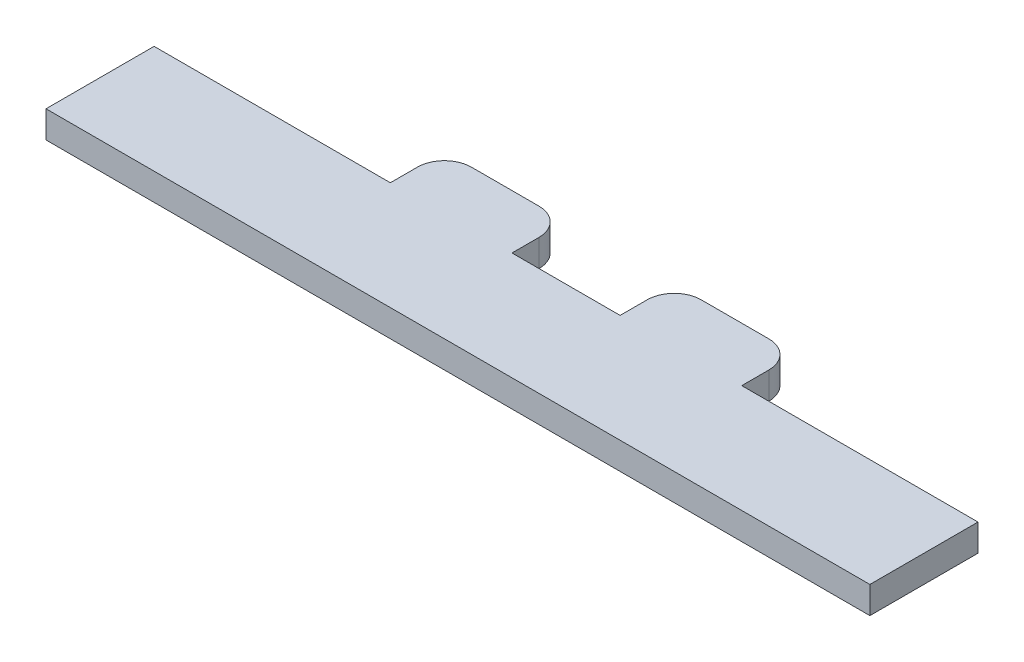
ISO-10303-21;
HEADER;
FILE_DESCRIPTION(('STEP AP214'),'2;1');
FILE_NAME('part.step','',(''),(''),'','','');
FILE_SCHEMA(('AUTOMOTIVE_DESIGN { 1 0 10303 214 1 1 1 1 }'));
ENDSEC;
DATA;
#1=APPLICATION_CONTEXT('core data for automotive mechanical design processes');
#2=APPLICATION_PROTOCOL_DEFINITION('international standard','automotive_design',2000,#1);
#3=PRODUCT_CONTEXT('',#1,'mechanical');
#4=PRODUCT('Part','Part','',(#3));
#5=PRODUCT_RELATED_PRODUCT_CATEGORY('part','',(#4));
#6=PRODUCT_DEFINITION_FORMATION('','',#4);
#7=PRODUCT_DEFINITION_CONTEXT('part definition',#1,'design');
#8=PRODUCT_DEFINITION('design','',#6,#7);
#9=PRODUCT_DEFINITION_SHAPE('','',#8);
#10=(LENGTH_UNIT() NAMED_UNIT(*) SI_UNIT(.MILLI.,.METRE.));
#11=(NAMED_UNIT(*) PLANE_ANGLE_UNIT() SI_UNIT($,.RADIAN.));
#12=(NAMED_UNIT(*) SI_UNIT($,.STERADIAN.) SOLID_ANGLE_UNIT());
#13=UNCERTAINTY_MEASURE_WITH_UNIT(LENGTH_MEASURE(1.E-05),#10,'distance_accuracy_value','');
#14=(GEOMETRIC_REPRESENTATION_CONTEXT(3) GLOBAL_UNCERTAINTY_ASSIGNED_CONTEXT((#13)) GLOBAL_UNIT_ASSIGNED_CONTEXT((#10,
#11,#12)) REPRESENTATION_CONTEXT('',''));
#15=CARTESIAN_POINT('',(0.,0.,0.));
#16=DIRECTION('',(0.,0.,1.));
#17=DIRECTION('',(1.,0.,0.));
#18=AXIS2_PLACEMENT_3D('',#15,#16,#17);
#19=CARTESIAN_POINT('',(0.,10.,-40.));
#20=DIRECTION('',(0.,0.,1.));
#21=DIRECTION('',(1.,0.,0.));
#22=AXIS2_PLACEMENT_3D('',#19,#20,#21);
#23=PLANE('',#22);
#24=DIRECTION('',(-1.,0.,0.));
#25=VECTOR('',#24,1.);
#26=CARTESIAN_POINT('',(0.,0.,-40.));
#27=LINE('',#26,#25);
#28=CARTESIAN_POINT('',(-30.,0.,-40.));
#29=VERTEX_POINT('',#28);
#30=CARTESIAN_POINT('',(-55.,0.,-40.));
#31=VERTEX_POINT('',#30);
#32=EDGE_CURVE('E207',#29,#31,#27,.T.);
#33=ORIENTED_EDGE('',*,*,#32,.T.);
#34=DIRECTION('',(0.,-1.,0.));
#35=VECTOR('',#34,1.);
#36=CARTESIAN_POINT('',(-55.,10.,-40.));
#37=LINE('',#36,#35);
#38=CARTESIAN_POINT('',(-55.,10.,-40.));
#39=VERTEX_POINT('',#38);
#40=EDGE_CURVE('E259',#31,#39,#37,.F.);
#41=ORIENTED_EDGE('',*,*,#40,.T.);
#42=DIRECTION('',(-1.,0.,0.));
#43=VECTOR('',#42,1.);
#44=CARTESIAN_POINT('',(0.,10.,-40.));
#45=LINE('',#44,#43);
#46=CARTESIAN_POINT('',(-30.,10.,-40.));
#47=VERTEX_POINT('',#46);
#48=EDGE_CURVE('E164',#47,#39,#45,.T.);
#49=ORIENTED_EDGE('',*,*,#48,.F.);
#50=DIRECTION('',(0.,-1.,0.));
#51=VECTOR('',#50,1.);
#52=CARTESIAN_POINT('',(-30.,10.,-40.));
#53=LINE('',#52,#51);
#54=EDGE_CURVE('E256',#47,#29,#53,.T.);
#55=ORIENTED_EDGE('',*,*,#54,.T.);
#56=EDGE_LOOP('',(#33,#41,#49,#55));
#57=FACE_BOUND('',#56,.T.);
#58=ADVANCED_FACE('F39',(#57),#23,.F.);
#59=CARTESIAN_POINT('',(-65.,10.,0.));
#60=DIRECTION('',(1.,0.,0.));
#61=DIRECTION('',(0.,0.,-1.));
#62=AXIS2_PLACEMENT_3D('',#59,#60,#61);
#63=PLANE('',#62);
#64=DIRECTION('',(0.,0.,1.));
#65=VECTOR('',#64,1.);
#66=CARTESIAN_POINT('',(-65.,10.,0.));
#67=LINE('',#66,#65);
#68=CARTESIAN_POINT('',(-65.,10.,-30.));
#69=VERTEX_POINT('',#68);
#70=CARTESIAN_POINT('',(-65.,10.,-20.));
#71=VERTEX_POINT('',#70);
#72=EDGE_CURVE('E153',#69,#71,#67,.T.);
#73=ORIENTED_EDGE('',*,*,#72,.F.);
#74=DIRECTION('',(0.,-1.,0.));
#75=VECTOR('',#74,1.);
#76=CARTESIAN_POINT('',(-65.,10.,-30.));
#77=LINE('',#76,#75);
#78=CARTESIAN_POINT('',(-65.,0.,-30.));
#79=VERTEX_POINT('',#78);
#80=EDGE_CURVE('E174',#69,#79,#77,.T.);
#81=ORIENTED_EDGE('',*,*,#80,.T.);
#82=DIRECTION('',(0.,0.,1.));
#83=VECTOR('',#82,1.);
#84=CARTESIAN_POINT('',(-65.,0.,0.));
#85=LINE('',#84,#83);
#86=CARTESIAN_POINT('',(-65.,0.,-20.));
#87=VERTEX_POINT('',#86);
#88=EDGE_CURVE('E170',#79,#87,#85,.T.);
#89=ORIENTED_EDGE('',*,*,#88,.T.);
#90=DIRECTION('',(0.,-1.,0.));
#91=VECTOR('',#90,1.);
#92=CARTESIAN_POINT('',(-65.,10.,-20.));
#93=LINE('',#92,#91);
#94=EDGE_CURVE('E167',#71,#87,#93,.T.);
#95=ORIENTED_EDGE('',*,*,#94,.F.);
#96=EDGE_LOOP('',(#73,#81,#89,#95));
#97=FACE_BOUND('',#96,.T.);
#98=ADVANCED_FACE('F168',(#97),#63,.F.);
#99=CARTESIAN_POINT('',(0.,10.,-20.));
#100=DIRECTION('',(0.,0.,-1.));
#101=DIRECTION('',(-1.,0.,0.));
#102=AXIS2_PLACEMENT_3D('',#99,#100,#101);
#103=PLANE('',#102);
#104=DIRECTION('',(1.,0.,0.));
#105=VECTOR('',#104,1.);
#106=CARTESIAN_POINT('',(0.,0.,-20.));
#107=LINE('',#106,#105);
#108=CARTESIAN_POINT('',(-152.4,0.,-20.));
#109=VERTEX_POINT('',#108);
#110=EDGE_CURVE('E211',#109,#87,#107,.T.);
#111=ORIENTED_EDGE('',*,*,#110,.F.);
#112=DIRECTION('',(0.,-1.,0.));
#113=VECTOR('',#112,1.);
#114=CARTESIAN_POINT('',(-152.4,10.,-20.));
#115=LINE('',#114,#113);
#116=CARTESIAN_POINT('',(-152.4,10.,-20.));
#117=VERTEX_POINT('',#116);
#118=EDGE_CURVE('E175',#117,#109,#115,.T.);
#119=ORIENTED_EDGE('',*,*,#118,.F.);
#120=DIRECTION('',(1.,0.,0.));
#121=VECTOR('',#120,1.);
#122=CARTESIAN_POINT('',(0.,10.,-20.));
#123=LINE('',#122,#121);
#124=EDGE_CURVE('E158',#117,#71,#123,.T.);
#125=ORIENTED_EDGE('',*,*,#124,.T.);
#126=ORIENTED_EDGE('',*,*,#94,.T.);
#127=EDGE_LOOP('',(#111,#119,#125,#126));
#128=FACE_BOUND('',#127,.T.);
#129=ADVANCED_FACE('F177',(#128),#103,.T.);
#130=CARTESIAN_POINT('',(-152.4,10.,0.));
#131=DIRECTION('',(1.,0.,0.));
#132=DIRECTION('',(0.,0.,-1.));
#133=AXIS2_PLACEMENT_3D('',#130,#131,#132);
#134=PLANE('',#133);
#135=DIRECTION('',(0.,0.,1.));
#136=VECTOR('',#135,1.);
#137=CARTESIAN_POINT('',(-152.4,0.,0.));
#138=LINE('',#137,#136);
#139=CARTESIAN_POINT('',(-152.4,0.,20.));
#140=VERTEX_POINT('',#139);
#141=EDGE_CURVE('E213',#109,#140,#138,.T.);
#142=ORIENTED_EDGE('',*,*,#141,.T.);
#143=DIRECTION('',(0.,-1.,0.));
#144=VECTOR('',#143,1.);
#145=CARTESIAN_POINT('',(-152.4,10.,20.));
#146=LINE('',#145,#144);
#147=CARTESIAN_POINT('',(-152.4,10.,20.));
#148=VERTEX_POINT('',#147);
#149=EDGE_CURVE('E243',#148,#140,#146,.T.);
#150=ORIENTED_EDGE('',*,*,#149,.F.);
#151=DIRECTION('',(0.,0.,1.));
#152=VECTOR('',#151,1.);
#153=CARTESIAN_POINT('',(-152.4,10.,0.));
#154=LINE('',#153,#152);
#155=EDGE_CURVE('E179',#117,#148,#154,.T.);
#156=ORIENTED_EDGE('',*,*,#155,.F.);
#157=ORIENTED_EDGE('',*,*,#118,.T.);
#158=EDGE_LOOP('',(#142,#150,#156,#157));
#159=FACE_BOUND('',#158,.T.);
#160=ADVANCED_FACE('F300',(#159),#134,.F.);
#161=CARTESIAN_POINT('',(0.,10.,20.));
#162=DIRECTION('',(0.,0.,-1.));
#163=DIRECTION('',(-1.,0.,0.));
#164=AXIS2_PLACEMENT_3D('',#161,#162,#163);
#165=PLANE('',#164);
#166=DIRECTION('',(1.,0.,0.));
#167=VECTOR('',#166,1.);
#168=CARTESIAN_POINT('',(0.,0.,20.));
#169=LINE('',#168,#167);
#170=CARTESIAN_POINT('',(152.4,0.,20.));
#171=VERTEX_POINT('',#170);
#172=EDGE_CURVE('E217',#140,#171,#169,.T.);
#173=ORIENTED_EDGE('',*,*,#172,.T.);
#174=DIRECTION('',(0.,-1.,0.));
#175=VECTOR('',#174,1.);
#176=CARTESIAN_POINT('',(152.4,10.,20.));
#177=LINE('',#176,#175);
#178=CARTESIAN_POINT('',(152.4,10.,20.));
#179=VERTEX_POINT('',#178);
#180=EDGE_CURVE('E241',#179,#171,#177,.T.);
#181=ORIENTED_EDGE('',*,*,#180,.F.);
#182=DIRECTION('',(1.,0.,0.));
#183=VECTOR('',#182,1.);
#184=CARTESIAN_POINT('',(0.,10.,20.));
#185=LINE('',#184,#183);
#186=EDGE_CURVE('E183',#148,#179,#185,.T.);
#187=ORIENTED_EDGE('',*,*,#186,.F.);
#188=ORIENTED_EDGE('',*,*,#149,.T.);
#189=EDGE_LOOP('',(#173,#181,#187,#188));
#190=FACE_BOUND('',#189,.T.);
#191=ADVANCED_FACE('F296',(#190),#165,.F.);
#192=CARTESIAN_POINT('',(152.4,10.,0.));
#193=DIRECTION('',(1.,0.,0.));
#194=DIRECTION('',(0.,0.,-1.));
#195=AXIS2_PLACEMENT_3D('',#192,#193,#194);
#196=PLANE('',#195);
#197=DIRECTION('',(0.,0.,1.));
#198=VECTOR('',#197,1.);
#199=CARTESIAN_POINT('',(152.4,0.,0.));
#200=LINE('',#199,#198);
#201=CARTESIAN_POINT('',(152.4,0.,-20.));
#202=VERTEX_POINT('',#201);
#203=EDGE_CURVE('E220',#202,#171,#200,.T.);
#204=ORIENTED_EDGE('',*,*,#203,.F.);
#205=DIRECTION('',(0.,-1.,0.));
#206=VECTOR('',#205,1.);
#207=CARTESIAN_POINT('',(152.4,10.,-20.));
#208=LINE('',#207,#206);
#209=CARTESIAN_POINT('',(152.4,10.,-20.));
#210=VERTEX_POINT('',#209);
#211=EDGE_CURVE('E239',#210,#202,#208,.T.);
#212=ORIENTED_EDGE('',*,*,#211,.F.);
#213=DIRECTION('',(0.,0.,1.));
#214=VECTOR('',#213,1.);
#215=CARTESIAN_POINT('',(152.4,10.,0.));
#216=LINE('',#215,#214);
#217=EDGE_CURVE('E190',#210,#179,#216,.T.);
#218=ORIENTED_EDGE('',*,*,#217,.T.);
#219=ORIENTED_EDGE('',*,*,#180,.T.);
#220=EDGE_LOOP('',(#204,#212,#218,#219));
#221=FACE_BOUND('',#220,.T.);
#222=ADVANCED_FACE('F292',(#221),#196,.T.);
#223=CARTESIAN_POINT('',(65.,0.,-20.));
#224=VERTEX_POINT('',#223);
#225=EDGE_CURVE('E215',#224,#202,#107,.T.);
#226=ORIENTED_EDGE('',*,*,#225,.F.);
#227=DIRECTION('',(0.,-1.,0.));
#228=VECTOR('',#227,1.);
#229=CARTESIAN_POINT('',(65.,10.,-20.));
#230=LINE('',#229,#228);
#231=CARTESIAN_POINT('',(65.,10.,-20.));
#232=VERTEX_POINT('',#231);
#233=EDGE_CURVE('E236',#232,#224,#230,.T.);
#234=ORIENTED_EDGE('',*,*,#233,.F.);
#235=EDGE_CURVE('E182',#232,#210,#123,.T.);
#236=ORIENTED_EDGE('',*,*,#235,.T.);
#237=ORIENTED_EDGE('',*,*,#211,.T.);
#238=EDGE_LOOP('',(#226,#234,#236,#237));
#239=FACE_BOUND('',#238,.T.);
#240=ADVANCED_FACE('F291',(#239),#103,.T.);
#241=CARTESIAN_POINT('',(65.,10.,0.));
#242=DIRECTION('',(1.,0.,0.));
#243=DIRECTION('',(0.,0.,-1.));
#244=AXIS2_PLACEMENT_3D('',#241,#242,#243);
#245=PLANE('',#244);
#246=DIRECTION('',(0.,0.,1.));
#247=VECTOR('',#246,1.);
#248=CARTESIAN_POINT('',(65.,0.,0.));
#249=LINE('',#248,#247);
#250=CARTESIAN_POINT('',(65.,0.,-30.));
#251=VERTEX_POINT('',#250);
#252=EDGE_CURVE('E223',#251,#224,#249,.T.);
#253=ORIENTED_EDGE('',*,*,#252,.F.);
#254=DIRECTION('',(0.,-1.,0.));
#255=VECTOR('',#254,1.);
#256=CARTESIAN_POINT('',(65.,10.,-30.));
#257=LINE('',#256,#255);
#258=CARTESIAN_POINT('',(65.,10.,-30.));
#259=VERTEX_POINT('',#258);
#260=EDGE_CURVE('E272',#251,#259,#257,.F.);
#261=ORIENTED_EDGE('',*,*,#260,.T.);
#262=DIRECTION('',(0.,0.,1.));
#263=VECTOR('',#262,1.);
#264=CARTESIAN_POINT('',(65.,10.,0.));
#265=LINE('',#264,#263);
#266=EDGE_CURVE('E189',#259,#232,#265,.T.);
#267=ORIENTED_EDGE('',*,*,#266,.T.);
#268=ORIENTED_EDGE('',*,*,#233,.T.);
#269=EDGE_LOOP('',(#253,#261,#267,#268));
#270=FACE_BOUND('',#269,.T.);
#271=ADVANCED_FACE('F311',(#270),#245,.T.);
#272=CARTESIAN_POINT('',(0.,10.,-40.));
#273=DIRECTION('',(0.,0.,-1.));
#274=DIRECTION('',(-1.,0.,0.));
#275=AXIS2_PLACEMENT_3D('',#272,#273,#274);
#276=PLANE('',#275);
#277=DIRECTION('',(1.,0.,0.));
#278=VECTOR('',#277,1.);
#279=CARTESIAN_POINT('',(0.,10.,-40.));
#280=LINE('',#279,#278);
#281=CARTESIAN_POINT('',(30.,10.,-40.));
#282=VERTEX_POINT('',#281);
#283=CARTESIAN_POINT('',(55.,10.,-40.));
#284=VERTEX_POINT('',#283);
#285=EDGE_CURVE('E194',#282,#284,#280,.T.);
#286=ORIENTED_EDGE('',*,*,#285,.T.);
#287=DIRECTION('',(0.,-1.,0.));
#288=VECTOR('',#287,1.);
#289=CARTESIAN_POINT('',(55.,10.,-40.));
#290=LINE('',#289,#288);
#291=CARTESIAN_POINT('',(55.,0.,-40.));
#292=VERTEX_POINT('',#291);
#293=EDGE_CURVE('E269',#284,#292,#290,.T.);
#294=ORIENTED_EDGE('',*,*,#293,.T.);
#295=DIRECTION('',(1.,0.,0.));
#296=VECTOR('',#295,1.);
#297=CARTESIAN_POINT('',(0.,0.,-40.));
#298=LINE('',#297,#296);
#299=CARTESIAN_POINT('',(30.,0.,-40.));
#300=VERTEX_POINT('',#299);
#301=EDGE_CURVE('E225',#300,#292,#298,.T.);
#302=ORIENTED_EDGE('',*,*,#301,.F.);
#303=DIRECTION('',(0.,-1.,0.));
#304=VECTOR('',#303,1.);
#305=CARTESIAN_POINT('',(30.,10.,-40.));
#306=LINE('',#305,#304);
#307=EDGE_CURVE('E267',#300,#282,#306,.F.);
#308=ORIENTED_EDGE('',*,*,#307,.T.);
#309=EDGE_LOOP('',(#286,#294,#302,#308));
#310=FACE_BOUND('',#309,.T.);
#311=ADVANCED_FACE('F309',(#310),#276,.T.);
#312=CARTESIAN_POINT('',(20.,10.,0.));
#313=DIRECTION('',(-1.,0.,0.));
#314=DIRECTION('',(0.,0.,1.));
#315=AXIS2_PLACEMENT_3D('',#312,#313,#314);
#316=PLANE('',#315);
#317=DIRECTION('',(0.,0.,-1.));
#318=VECTOR('',#317,1.);
#319=CARTESIAN_POINT('',(20.,10.,0.));
#320=LINE('',#319,#318);
#321=CARTESIAN_POINT('',(20.,10.,-20.));
#322=VERTEX_POINT('',#321);
#323=CARTESIAN_POINT('',(20.,10.,-30.));
#324=VERTEX_POINT('',#323);
#325=EDGE_CURVE('E187',#322,#324,#320,.T.);
#326=ORIENTED_EDGE('',*,*,#325,.T.);
#327=DIRECTION('',(0.,-1.,0.));
#328=VECTOR('',#327,1.);
#329=CARTESIAN_POINT('',(20.,10.,-30.));
#330=LINE('',#329,#328);
#331=CARTESIAN_POINT('',(20.,0.,-30.));
#332=VERTEX_POINT('',#331);
#333=EDGE_CURVE('E47',#324,#332,#330,.T.);
#334=ORIENTED_EDGE('',*,*,#333,.T.);
#335=DIRECTION('',(0.,0.,-1.));
#336=VECTOR('',#335,1.);
#337=CARTESIAN_POINT('',(20.,0.,0.));
#338=LINE('',#337,#336);
#339=CARTESIAN_POINT('',(20.,0.,-20.));
#340=VERTEX_POINT('',#339);
#341=EDGE_CURVE('E228',#340,#332,#338,.T.);
#342=ORIENTED_EDGE('',*,*,#341,.F.);
#343=DIRECTION('',(0.,-1.,0.));
#344=VECTOR('',#343,1.);
#345=CARTESIAN_POINT('',(20.,10.,-20.));
#346=LINE('',#345,#344);
#347=EDGE_CURVE('E234',#322,#340,#346,.T.);
#348=ORIENTED_EDGE('',*,*,#347,.F.);
#349=EDGE_LOOP('',(#326,#334,#342,#348));
#350=FACE_BOUND('',#349,.T.);
#351=ADVANCED_FACE('F277',(#350),#316,.T.);
#352=CARTESIAN_POINT('',(-20.,0.,-20.));
#353=VERTEX_POINT('',#352);
#354=EDGE_CURVE('E214',#353,#340,#107,.T.);
#355=ORIENTED_EDGE('',*,*,#354,.F.);
#356=DIRECTION('',(0.,-1.,0.));
#357=VECTOR('',#356,1.);
#358=CARTESIAN_POINT('',(-20.,10.,-20.));
#359=LINE('',#358,#357);
#360=CARTESIAN_POINT('',(-20.,10.,-20.));
#361=VERTEX_POINT('',#360);
#362=EDGE_CURVE('E206',#361,#353,#359,.T.);
#363=ORIENTED_EDGE('',*,*,#362,.F.);
#364=EDGE_CURVE('E181',#361,#322,#123,.T.);
#365=ORIENTED_EDGE('',*,*,#364,.T.);
#366=ORIENTED_EDGE('',*,*,#347,.T.);
#367=EDGE_LOOP('',(#355,#363,#365,#366));
#368=FACE_BOUND('',#367,.T.);
#369=ADVANCED_FACE('F321',(#368),#103,.T.);
#370=CARTESIAN_POINT('',(-20.,10.,0.));
#371=DIRECTION('',(-1.,0.,0.));
#372=DIRECTION('',(0.,0.,1.));
#373=AXIS2_PLACEMENT_3D('',#370,#371,#372);
#374=PLANE('',#373);
#375=DIRECTION('',(0.,0.,-1.));
#376=VECTOR('',#375,1.);
#377=CARTESIAN_POINT('',(-20.,0.,0.));
#378=LINE('',#377,#376);
#379=CARTESIAN_POINT('',(-20.,0.,-30.));
#380=VERTEX_POINT('',#379);
#381=EDGE_CURVE('E231',#353,#380,#378,.T.);
#382=ORIENTED_EDGE('',*,*,#381,.T.);
#383=DIRECTION('',(0.,-1.,0.));
#384=VECTOR('',#383,1.);
#385=CARTESIAN_POINT('',(-20.,10.,-30.));
#386=LINE('',#385,#384);
#387=CARTESIAN_POINT('',(-20.,10.,-30.));
#388=VERTEX_POINT('',#387);
#389=EDGE_CURVE('E11',#380,#388,#386,.F.);
#390=ORIENTED_EDGE('',*,*,#389,.T.);
#391=DIRECTION('',(0.,0.,-1.));
#392=VECTOR('',#391,1.);
#393=CARTESIAN_POINT('',(-20.,10.,0.));
#394=LINE('',#393,#392);
#395=EDGE_CURVE('E186',#361,#388,#394,.T.);
#396=ORIENTED_EDGE('',*,*,#395,.F.);
#397=ORIENTED_EDGE('',*,*,#362,.T.);
#398=EDGE_LOOP('',(#382,#390,#396,#397));
#399=FACE_BOUND('',#398,.T.);
#400=ADVANCED_FACE('F352',(#399),#374,.F.);
#401=CARTESIAN_POINT('',(0.,10.,0.));
#402=DIRECTION('',(0.,1.,0.));
#403=DIRECTION('',(0.,0.,1.));
#404=AXIS2_PLACEMENT_3D('',#401,#402,#403);
#405=PLANE('',#404);
#406=ORIENTED_EDGE('',*,*,#48,.T.);
#407=CARTESIAN_POINT('',(-55.,10.,-30.));
#408=DIRECTION('',(0.,1.,0.));
#409=DIRECTION('',(0.,0.,1.));
#410=AXIS2_PLACEMENT_3D('',#407,#408,#409);
#411=CIRCLE('',#410,10.);
#412=EDGE_CURVE('E160',#39,#69,#411,.T.);
#413=ORIENTED_EDGE('',*,*,#412,.T.);
#414=ORIENTED_EDGE('',*,*,#72,.T.);
#415=ORIENTED_EDGE('',*,*,#124,.F.);
#416=ORIENTED_EDGE('',*,*,#155,.T.);
#417=ORIENTED_EDGE('',*,*,#186,.T.);
#418=ORIENTED_EDGE('',*,*,#217,.F.);
#419=ORIENTED_EDGE('',*,*,#235,.F.);
#420=ORIENTED_EDGE('',*,*,#266,.F.);
#421=CARTESIAN_POINT('',(55.,10.,-30.));
#422=DIRECTION('',(0.,1.,0.));
#423=DIRECTION('',(0.,0.,1.));
#424=AXIS2_PLACEMENT_3D('',#421,#422,#423);
#425=CIRCLE('',#424,10.);
#426=EDGE_CURVE('E264',#259,#284,#425,.T.);
#427=ORIENTED_EDGE('',*,*,#426,.T.);
#428=ORIENTED_EDGE('',*,*,#285,.F.);
#429=CARTESIAN_POINT('',(30.,10.,-30.));
#430=DIRECTION('',(0.,1.,0.));
#431=DIRECTION('',(0.,0.,1.));
#432=AXIS2_PLACEMENT_3D('',#429,#430,#431);
#433=CIRCLE('',#432,10.);
#434=EDGE_CURVE('E60',#282,#324,#433,.T.);
#435=ORIENTED_EDGE('',*,*,#434,.T.);
#436=ORIENTED_EDGE('',*,*,#325,.F.);
#437=ORIENTED_EDGE('',*,*,#364,.F.);
#438=ORIENTED_EDGE('',*,*,#395,.T.);
#439=CARTESIAN_POINT('',(-30.,10.,-30.));
#440=DIRECTION('',(0.,1.,0.));
#441=DIRECTION('',(0.,0.,1.));
#442=AXIS2_PLACEMENT_3D('',#439,#440,#441);
#443=CIRCLE('',#442,10.);
#444=EDGE_CURVE('E261',#388,#47,#443,.T.);
#445=ORIENTED_EDGE('',*,*,#444,.T.);
#446=EDGE_LOOP('',(#406,#413,#414,#415,#416,#417,#418,#419,#420,#427,#428,#435,#436,#437,#438,#445));
#447=FACE_BOUND('',#446,.T.);
#448=ADVANCED_FACE('F156',(#447),#405,.T.);
#449=CARTESIAN_POINT('',(0.,0.,0.));
#450=DIRECTION('',(0.,1.,0.));
#451=DIRECTION('',(0.,0.,1.));
#452=AXIS2_PLACEMENT_3D('',#449,#450,#451);
#453=PLANE('',#452);
#454=ORIENTED_EDGE('',*,*,#88,.F.);
#455=CARTESIAN_POINT('',(-55.,0.,-30.));
#456=DIRECTION('',(0.,1.,0.));
#457=DIRECTION('',(0.,0.,1.));
#458=AXIS2_PLACEMENT_3D('',#455,#456,#457);
#459=CIRCLE('',#458,10.);
#460=EDGE_CURVE('E254',#79,#31,#459,.F.);
#461=ORIENTED_EDGE('',*,*,#460,.T.);
#462=ORIENTED_EDGE('',*,*,#32,.F.);
#463=CARTESIAN_POINT('',(-30.,0.,-30.));
#464=DIRECTION('',(0.,1.,0.));
#465=DIRECTION('',(0.,0.,1.));
#466=AXIS2_PLACEMENT_3D('',#463,#464,#465);
#467=CIRCLE('',#466,10.);
#468=EDGE_CURVE('E248',#29,#380,#467,.F.);
#469=ORIENTED_EDGE('',*,*,#468,.T.);
#470=ORIENTED_EDGE('',*,*,#381,.F.);
#471=ORIENTED_EDGE('',*,*,#354,.T.);
#472=ORIENTED_EDGE('',*,*,#341,.T.);
#473=CARTESIAN_POINT('',(30.,0.,-30.));
#474=DIRECTION('',(0.,1.,0.));
#475=DIRECTION('',(0.,0.,1.));
#476=AXIS2_PLACEMENT_3D('',#473,#474,#475);
#477=CIRCLE('',#476,10.);
#478=EDGE_CURVE('E250',#332,#300,#477,.F.);
#479=ORIENTED_EDGE('',*,*,#478,.T.);
#480=ORIENTED_EDGE('',*,*,#301,.T.);
#481=CARTESIAN_POINT('',(55.,0.,-30.));
#482=DIRECTION('',(0.,1.,0.));
#483=DIRECTION('',(0.,0.,1.));
#484=AXIS2_PLACEMENT_3D('',#481,#482,#483);
#485=CIRCLE('',#484,10.);
#486=EDGE_CURVE('E252',#292,#251,#485,.F.);
#487=ORIENTED_EDGE('',*,*,#486,.T.);
#488=ORIENTED_EDGE('',*,*,#252,.T.);
#489=ORIENTED_EDGE('',*,*,#225,.T.);
#490=ORIENTED_EDGE('',*,*,#203,.T.);
#491=ORIENTED_EDGE('',*,*,#172,.F.);
#492=ORIENTED_EDGE('',*,*,#141,.F.);
#493=ORIENTED_EDGE('',*,*,#110,.T.);
#494=EDGE_LOOP('',(#454,#461,#462,#469,#470,#471,#472,#479,#480,#487,#488,#489,#490,#491,#492,#493));
#495=FACE_BOUND('',#494,.T.);
#496=ADVANCED_FACE('F281',(#495),#453,.F.);
#497=CARTESIAN_POINT('',(-55.,10.,-30.));
#498=DIRECTION('',(0.,-1.,0.));
#499=DIRECTION('',(0.,0.,-1.));
#500=AXIS2_PLACEMENT_3D('',#497,#498,#499);
#501=CYLINDRICAL_SURFACE('',#500,10.);
#502=ORIENTED_EDGE('',*,*,#412,.F.);
#503=ORIENTED_EDGE('',*,*,#40,.F.);
#504=ORIENTED_EDGE('',*,*,#460,.F.);
#505=ORIENTED_EDGE('',*,*,#80,.F.);
#506=EDGE_LOOP('',(#502,#503,#504,#505));
#507=FACE_BOUND('',#506,.T.);
#508=ADVANCED_FACE('F332',(#507),#501,.T.);
#509=CARTESIAN_POINT('',(55.,10.,-30.));
#510=DIRECTION('',(0.,-1.,0.));
#511=DIRECTION('',(0.,0.,-1.));
#512=AXIS2_PLACEMENT_3D('',#509,#510,#511);
#513=CYLINDRICAL_SURFACE('',#512,10.);
#514=ORIENTED_EDGE('',*,*,#426,.F.);
#515=ORIENTED_EDGE('',*,*,#260,.F.);
#516=ORIENTED_EDGE('',*,*,#486,.F.);
#517=ORIENTED_EDGE('',*,*,#293,.F.);
#518=EDGE_LOOP('',(#514,#515,#516,#517));
#519=FACE_BOUND('',#518,.T.);
#520=ADVANCED_FACE('F307',(#519),#513,.T.);
#521=CARTESIAN_POINT('',(30.,10.,-30.));
#522=DIRECTION('',(0.,-1.,0.));
#523=DIRECTION('',(0.,0.,-1.));
#524=AXIS2_PLACEMENT_3D('',#521,#522,#523);
#525=CYLINDRICAL_SURFACE('',#524,10.);
#526=ORIENTED_EDGE('',*,*,#434,.F.);
#527=ORIENTED_EDGE('',*,*,#307,.F.);
#528=ORIENTED_EDGE('',*,*,#478,.F.);
#529=ORIENTED_EDGE('',*,*,#333,.F.);
#530=EDGE_LOOP('',(#526,#527,#528,#529));
#531=FACE_BOUND('',#530,.T.);
#532=ADVANCED_FACE('F337',(#531),#525,.T.);
#533=CARTESIAN_POINT('',(-30.,10.,-30.));
#534=DIRECTION('',(0.,-1.,0.));
#535=DIRECTION('',(0.,0.,-1.));
#536=AXIS2_PLACEMENT_3D('',#533,#534,#535);
#537=CYLINDRICAL_SURFACE('',#536,10.);
#538=ORIENTED_EDGE('',*,*,#444,.F.);
#539=ORIENTED_EDGE('',*,*,#389,.F.);
#540=ORIENTED_EDGE('',*,*,#468,.F.);
#541=ORIENTED_EDGE('',*,*,#54,.F.);
#542=EDGE_LOOP('',(#538,#539,#540,#541));
#543=FACE_BOUND('',#542,.T.);
#544=ADVANCED_FACE('F41',(#543),#537,.T.);
#545=CLOSED_SHELL('',(#58,#98,#129,#160,#191,#222,#240,#271,#311,#351,#369,#400,#448,#496,#508,
#520,#532,#544));
#546=MANIFOLD_SOLID_BREP('B2',#545);
#547=ADVANCED_BREP_SHAPE_REPRESENTATION('',(#18,#546),#14);
#548=SHAPE_DEFINITION_REPRESENTATION(#9,#547);
ENDSEC;
END-ISO-10303-21;
